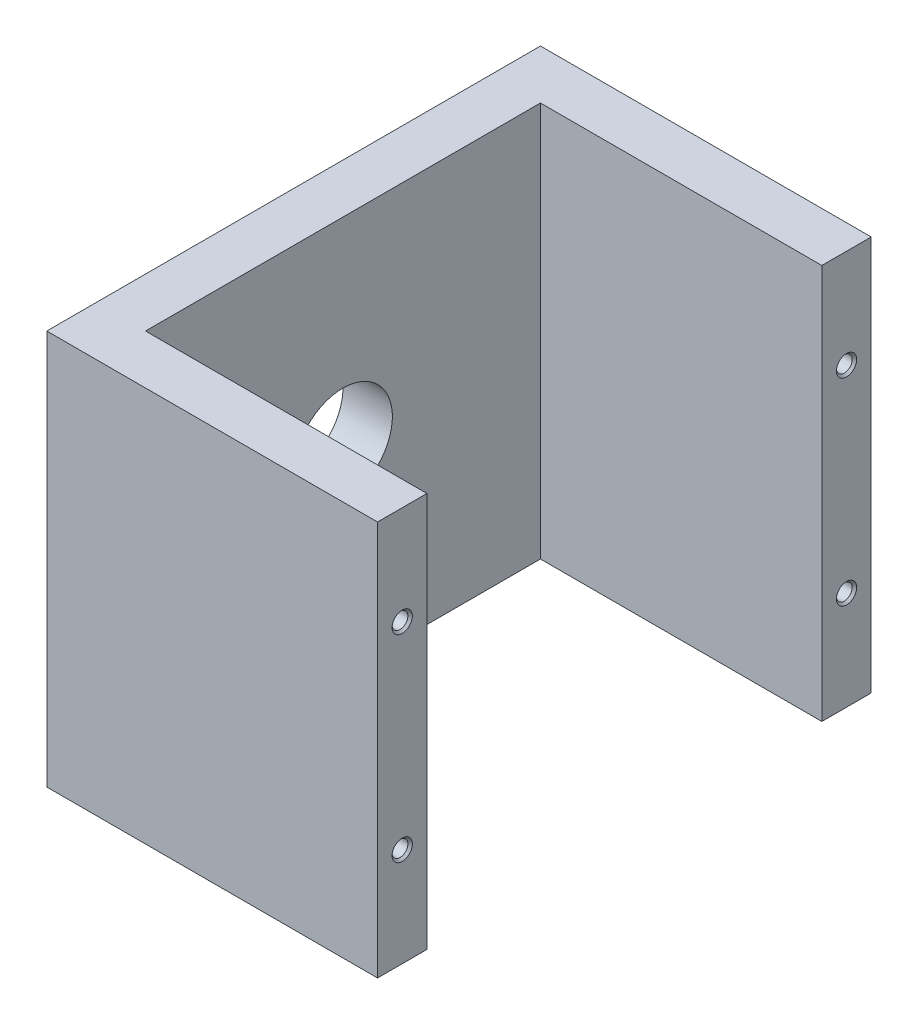
ISO-10303-21;
HEADER;
FILE_DESCRIPTION(('STEP AP214'),'2;1');
FILE_NAME('part.step','',(''),(''),'','','');
FILE_SCHEMA(('AUTOMOTIVE_DESIGN { 1 0 10303 214 1 1 1 1 }'));
ENDSEC;
DATA;
#1=APPLICATION_CONTEXT('core data for automotive mechanical design processes');
#2=APPLICATION_PROTOCOL_DEFINITION('international standard','automotive_design',2000,#1);
#3=PRODUCT_CONTEXT('',#1,'mechanical');
#4=PRODUCT('Part','Part','',(#3));
#5=PRODUCT_RELATED_PRODUCT_CATEGORY('part','',(#4));
#6=PRODUCT_DEFINITION_FORMATION('','',#4);
#7=PRODUCT_DEFINITION_CONTEXT('part definition',#1,'design');
#8=PRODUCT_DEFINITION('design','',#6,#7);
#9=PRODUCT_DEFINITION_SHAPE('','',#8);
#10=(LENGTH_UNIT() NAMED_UNIT(*) SI_UNIT(.MILLI.,.METRE.));
#11=(NAMED_UNIT(*) PLANE_ANGLE_UNIT() SI_UNIT($,.RADIAN.));
#12=(NAMED_UNIT(*) SI_UNIT($,.STERADIAN.) SOLID_ANGLE_UNIT());
#13=UNCERTAINTY_MEASURE_WITH_UNIT(LENGTH_MEASURE(1.E-05),#10,'distance_accuracy_value','');
#14=(GEOMETRIC_REPRESENTATION_CONTEXT(3) GLOBAL_UNCERTAINTY_ASSIGNED_CONTEXT((#13)) GLOBAL_UNIT_ASSIGNED_CONTEXT((#10,
#11,#12)) REPRESENTATION_CONTEXT('',''));
#15=CARTESIAN_POINT('',(0.,0.,0.));
#16=DIRECTION('',(0.,0.,1.));
#17=DIRECTION('',(1.,0.,0.));
#18=AXIS2_PLACEMENT_3D('',#15,#16,#17);
#19=CARTESIAN_POINT('',(0.,40.,50.));
#20=DIRECTION('',(1.,0.,0.));
#21=DIRECTION('',(0.,0.,-1.));
#22=AXIS2_PLACEMENT_3D('',#19,#20,#21);
#23=PLANE('',#22);
#24=CARTESIAN_POINT('',(0.,20.,25.));
#25=DIRECTION('',(-1.,0.,0.));
#26=DIRECTION('',(0.,0.,1.));
#27=AXIS2_PLACEMENT_3D('',#24,#25,#26);
#28=CIRCLE('',#27,5.);
#29=CARTESIAN_POINT('',(0.,20.,30.));
#30=VERTEX_POINT('',#29);
#31=EDGE_CURVE('E217',#30,#30,#28,.T.);
#32=ORIENTED_EDGE('',*,*,#31,.F.);
#33=EDGE_LOOP('',(#32));
#34=FACE_BOUND('',#33,.T.);
#35=DIRECTION('',(0.,0.,1.));
#36=VECTOR('',#35,1.);
#37=CARTESIAN_POINT('',(0.,0.,50.));
#38=LINE('',#37,#36);
#39=CARTESIAN_POINT('',(0.,0.,0.));
#40=VERTEX_POINT('',#39);
#41=CARTESIAN_POINT('',(0.,0.,50.));
#42=VERTEX_POINT('',#41);
#43=EDGE_CURVE('E147',#40,#42,#38,.T.);
#44=ORIENTED_EDGE('',*,*,#43,.T.);
#45=DIRECTION('',(0.,-1.,0.));
#46=VECTOR('',#45,1.);
#47=CARTESIAN_POINT('',(0.,40.,50.));
#48=LINE('',#47,#46);
#49=CARTESIAN_POINT('',(0.,40.,50.));
#50=VERTEX_POINT('',#49);
#51=EDGE_CURVE('E11',#50,#42,#48,.T.);
#52=ORIENTED_EDGE('',*,*,#51,.F.);
#53=DIRECTION('',(0.,0.,1.));
#54=VECTOR('',#53,1.);
#55=CARTESIAN_POINT('',(0.,40.,50.));
#56=LINE('',#55,#54);
#57=CARTESIAN_POINT('',(0.,40.,0.));
#58=VERTEX_POINT('',#57);
#59=EDGE_CURVE('E170',#58,#50,#56,.T.);
#60=ORIENTED_EDGE('',*,*,#59,.F.);
#61=DIRECTION('',(0.,-1.,0.));
#62=VECTOR('',#61,1.);
#63=CARTESIAN_POINT('',(0.,40.,0.));
#64=LINE('',#63,#62);
#65=EDGE_CURVE('E143',#58,#40,#64,.T.);
#66=ORIENTED_EDGE('',*,*,#65,.T.);
#67=EDGE_LOOP('',(#44,#52,#60,#66));
#68=FACE_BOUND('',#67,.T.);
#69=ADVANCED_FACE('F43',(#34,#68),#23,.F.);
#70=CARTESIAN_POINT('',(33.5,40.,50.));
#71=DIRECTION('',(0.,0.,-1.));
#72=DIRECTION('',(-1.,0.,0.));
#73=AXIS2_PLACEMENT_3D('',#70,#71,#72);
#74=PLANE('',#73);
#75=DIRECTION('',(1.,0.,0.));
#76=VECTOR('',#75,1.);
#77=CARTESIAN_POINT('',(33.5,0.,50.));
#78=LINE('',#77,#76);
#79=CARTESIAN_POINT('',(33.5,0.,50.));
#80=VERTEX_POINT('',#79);
#81=EDGE_CURVE('E151',#42,#80,#78,.T.);
#82=ORIENTED_EDGE('',*,*,#81,.T.);
#83=DIRECTION('',(0.,-1.,0.));
#84=VECTOR('',#83,1.);
#85=CARTESIAN_POINT('',(33.5,40.,50.));
#86=LINE('',#85,#84);
#87=CARTESIAN_POINT('',(33.5,40.,50.));
#88=VERTEX_POINT('',#87);
#89=EDGE_CURVE('E52',#88,#80,#86,.T.);
#90=ORIENTED_EDGE('',*,*,#89,.F.);
#91=DIRECTION('',(1.,0.,0.));
#92=VECTOR('',#91,1.);
#93=CARTESIAN_POINT('',(33.5,40.,50.));
#94=LINE('',#93,#92);
#95=EDGE_CURVE('E104',#50,#88,#94,.T.);
#96=ORIENTED_EDGE('',*,*,#95,.F.);
#97=ORIENTED_EDGE('',*,*,#51,.T.);
#98=EDGE_LOOP('',(#82,#90,#96,#97));
#99=FACE_BOUND('',#98,.T.);
#100=ADVANCED_FACE('F274',(#99),#74,.F.);
#101=CARTESIAN_POINT('',(33.5,40.,45.));
#102=DIRECTION('',(-1.,0.,0.));
#103=DIRECTION('',(0.,0.,1.));
#104=AXIS2_PLACEMENT_3D('',#101,#102,#103);
#105=PLANE('',#104);
#106=CARTESIAN_POINT('',(33.5,30.,47.5));
#107=DIRECTION('',(1.,0.,0.));
#108=DIRECTION('',(0.,0.,-1.));
#109=AXIS2_PLACEMENT_3D('',#106,#107,#108);
#110=CIRCLE('',#109,1.025);
#111=CARTESIAN_POINT('',(33.5,30.,46.475));
#112=VERTEX_POINT('',#111);
#113=EDGE_CURVE('E265',#112,#112,#110,.T.);
#114=ORIENTED_EDGE('',*,*,#113,.F.);
#115=EDGE_LOOP('',(#114));
#116=FACE_BOUND('',#115,.T.);
#117=CARTESIAN_POINT('',(33.5,10.,47.5));
#118=DIRECTION('',(1.,0.,0.));
#119=DIRECTION('',(0.,0.,-1.));
#120=AXIS2_PLACEMENT_3D('',#117,#118,#119);
#121=CIRCLE('',#120,1.025);
#122=CARTESIAN_POINT('',(33.5,10.,46.475));
#123=VERTEX_POINT('',#122);
#124=EDGE_CURVE('E253',#123,#123,#121,.T.);
#125=ORIENTED_EDGE('',*,*,#124,.F.);
#126=EDGE_LOOP('',(#125));
#127=FACE_BOUND('',#126,.T.);
#128=DIRECTION('',(0.,0.,-1.));
#129=VECTOR('',#128,1.);
#130=CARTESIAN_POINT('',(33.5,0.,45.));
#131=LINE('',#130,#129);
#132=CARTESIAN_POINT('',(33.5,0.,45.));
#133=VERTEX_POINT('',#132);
#134=EDGE_CURVE('E155',#80,#133,#131,.T.);
#135=ORIENTED_EDGE('',*,*,#134,.T.);
#136=DIRECTION('',(0.,-1.,0.));
#137=VECTOR('',#136,1.);
#138=CARTESIAN_POINT('',(33.5,40.,45.));
#139=LINE('',#138,#137);
#140=CARTESIAN_POINT('',(33.5,40.,45.));
#141=VERTEX_POINT('',#140);
#142=EDGE_CURVE('E181',#141,#133,#139,.T.);
#143=ORIENTED_EDGE('',*,*,#142,.F.);
#144=DIRECTION('',(0.,0.,-1.));
#145=VECTOR('',#144,1.);
#146=CARTESIAN_POINT('',(33.5,40.,45.));
#147=LINE('',#146,#145);
#148=EDGE_CURVE('E191',#88,#141,#147,.T.);
#149=ORIENTED_EDGE('',*,*,#148,.F.);
#150=ORIENTED_EDGE('',*,*,#89,.T.);
#151=EDGE_LOOP('',(#135,#143,#149,#150));
#152=FACE_BOUND('',#151,.T.);
#153=ADVANCED_FACE('F189',(#116,#127,#152),#105,.F.);
#154=CARTESIAN_POINT('',(5.00000000000001,40.,45.));
#155=DIRECTION('',(0.,0.,1.));
#156=DIRECTION('',(1.,0.,0.));
#157=AXIS2_PLACEMENT_3D('',#154,#155,#156);
#158=PLANE('',#157);
#159=DIRECTION('',(-1.,0.,0.));
#160=VECTOR('',#159,1.);
#161=CARTESIAN_POINT('',(5.00000000000001,0.,45.));
#162=LINE('',#161,#160);
#163=CARTESIAN_POINT('',(5.00000000000001,0.,45.));
#164=VERTEX_POINT('',#163);
#165=EDGE_CURVE('E158',#133,#164,#162,.T.);
#166=ORIENTED_EDGE('',*,*,#165,.T.);
#167=DIRECTION('',(0.,-1.,0.));
#168=VECTOR('',#167,1.);
#169=CARTESIAN_POINT('',(5.00000000000001,40.,45.));
#170=LINE('',#169,#168);
#171=CARTESIAN_POINT('',(5.00000000000001,40.,45.));
#172=VERTEX_POINT('',#171);
#173=EDGE_CURVE('E177',#172,#164,#170,.T.);
#174=ORIENTED_EDGE('',*,*,#173,.F.);
#175=DIRECTION('',(-1.,0.,0.));
#176=VECTOR('',#175,1.);
#177=CARTESIAN_POINT('',(5.00000000000001,40.,45.));
#178=LINE('',#177,#176);
#179=EDGE_CURVE('E204',#141,#172,#178,.T.);
#180=ORIENTED_EDGE('',*,*,#179,.F.);
#181=ORIENTED_EDGE('',*,*,#142,.T.);
#182=EDGE_LOOP('',(#166,#174,#180,#181));
#183=FACE_BOUND('',#182,.T.);
#184=ADVANCED_FACE('F199',(#183),#158,.F.);
#185=CARTESIAN_POINT('',(5.,40.,5.));
#186=DIRECTION('',(-1.,0.,0.));
#187=DIRECTION('',(0.,0.,1.));
#188=AXIS2_PLACEMENT_3D('',#185,#186,#187);
#189=PLANE('',#188);
#190=CARTESIAN_POINT('',(5.,20.,25.));
#191=DIRECTION('',(-1.,0.,0.));
#192=DIRECTION('',(0.,0.,1.));
#193=AXIS2_PLACEMENT_3D('',#190,#191,#192);
#194=CIRCLE('',#193,5.);
#195=CARTESIAN_POINT('',(5.00000000000001,20.,30.));
#196=VERTEX_POINT('',#195);
#197=EDGE_CURVE('E152',#196,#196,#194,.F.);
#198=ORIENTED_EDGE('',*,*,#197,.F.);
#199=EDGE_LOOP('',(#198));
#200=FACE_BOUND('',#199,.T.);
#201=DIRECTION('',(0.,0.,-1.));
#202=VECTOR('',#201,1.);
#203=CARTESIAN_POINT('',(5.,0.,5.));
#204=LINE('',#203,#202);
#205=CARTESIAN_POINT('',(5.,0.,5.));
#206=VERTEX_POINT('',#205);
#207=EDGE_CURVE('E161',#164,#206,#204,.T.);
#208=ORIENTED_EDGE('',*,*,#207,.T.);
#209=DIRECTION('',(0.,-1.,0.));
#210=VECTOR('',#209,1.);
#211=CARTESIAN_POINT('',(5.,40.,5.));
#212=LINE('',#211,#210);
#213=CARTESIAN_POINT('',(5.,40.,5.));
#214=VERTEX_POINT('',#213);
#215=EDGE_CURVE('E136',#214,#206,#212,.T.);
#216=ORIENTED_EDGE('',*,*,#215,.F.);
#217=DIRECTION('',(0.,0.,-1.));
#218=VECTOR('',#217,1.);
#219=CARTESIAN_POINT('',(5.,40.,5.));
#220=LINE('',#219,#218);
#221=EDGE_CURVE('E125',#172,#214,#220,.T.);
#222=ORIENTED_EDGE('',*,*,#221,.F.);
#223=ORIENTED_EDGE('',*,*,#173,.T.);
#224=EDGE_LOOP('',(#208,#216,#222,#223));
#225=FACE_BOUND('',#224,.T.);
#226=ADVANCED_FACE('F202',(#200,#225),#189,.F.);
#227=CARTESIAN_POINT('',(33.5,40.,5.));
#228=DIRECTION('',(0.,0.,-1.));
#229=DIRECTION('',(-1.,0.,0.));
#230=AXIS2_PLACEMENT_3D('',#227,#228,#229);
#231=PLANE('',#230);
#232=DIRECTION('',(1.,0.,0.));
#233=VECTOR('',#232,1.);
#234=CARTESIAN_POINT('',(33.5,0.,5.));
#235=LINE('',#234,#233);
#236=CARTESIAN_POINT('',(33.5,0.,5.));
#237=VERTEX_POINT('',#236);
#238=EDGE_CURVE('E134',#206,#237,#235,.T.);
#239=ORIENTED_EDGE('',*,*,#238,.T.);
#240=DIRECTION('',(0.,-1.,0.));
#241=VECTOR('',#240,1.);
#242=CARTESIAN_POINT('',(33.5,40.,5.));
#243=LINE('',#242,#241);
#244=CARTESIAN_POINT('',(33.5,40.,5.));
#245=VERTEX_POINT('',#244);
#246=EDGE_CURVE('E131',#245,#237,#243,.T.);
#247=ORIENTED_EDGE('',*,*,#246,.F.);
#248=DIRECTION('',(1.,0.,0.));
#249=VECTOR('',#248,1.);
#250=CARTESIAN_POINT('',(33.5,40.,5.));
#251=LINE('',#250,#249);
#252=EDGE_CURVE('E119',#214,#245,#251,.T.);
#253=ORIENTED_EDGE('',*,*,#252,.F.);
#254=ORIENTED_EDGE('',*,*,#215,.T.);
#255=EDGE_LOOP('',(#239,#247,#253,#254));
#256=FACE_BOUND('',#255,.T.);
#257=ADVANCED_FACE('F132',(#256),#231,.F.);
#258=CARTESIAN_POINT('',(33.5,40.,0.));
#259=DIRECTION('',(-1.,0.,0.));
#260=DIRECTION('',(0.,0.,1.));
#261=AXIS2_PLACEMENT_3D('',#258,#259,#260);
#262=PLANE('',#261);
#263=CARTESIAN_POINT('',(33.5,10.,2.49999999999998));
#264=DIRECTION('',(1.,0.,0.));
#265=DIRECTION('',(0.,0.,-1.));
#266=AXIS2_PLACEMENT_3D('',#263,#264,#265);
#267=CIRCLE('',#266,1.025);
#268=CARTESIAN_POINT('',(33.5,10.,1.47499999999998));
#269=VERTEX_POINT('',#268);
#270=EDGE_CURVE('E241',#269,#269,#267,.T.);
#271=ORIENTED_EDGE('',*,*,#270,.F.);
#272=EDGE_LOOP('',(#271));
#273=FACE_BOUND('',#272,.T.);
#274=CARTESIAN_POINT('',(33.5,30.,2.49999999999998));
#275=DIRECTION('',(1.,0.,0.));
#276=DIRECTION('',(0.,0.,-1.));
#277=AXIS2_PLACEMENT_3D('',#274,#275,#276);
#278=CIRCLE('',#277,1.025);
#279=CARTESIAN_POINT('',(33.5,30.,1.47499999999999));
#280=VERTEX_POINT('',#279);
#281=EDGE_CURVE('E229',#280,#280,#278,.T.);
#282=ORIENTED_EDGE('',*,*,#281,.F.);
#283=EDGE_LOOP('',(#282));
#284=FACE_BOUND('',#283,.T.);
#285=DIRECTION('',(0.,0.,-1.));
#286=VECTOR('',#285,1.);
#287=CARTESIAN_POINT('',(33.5,0.,0.));
#288=LINE('',#287,#286);
#289=CARTESIAN_POINT('',(33.5,0.,0.));
#290=VERTEX_POINT('',#289);
#291=EDGE_CURVE('E90',#237,#290,#288,.T.);
#292=ORIENTED_EDGE('',*,*,#291,.T.);
#293=DIRECTION('',(0.,-1.,0.));
#294=VECTOR('',#293,1.);
#295=CARTESIAN_POINT('',(33.5,40.,0.));
#296=LINE('',#295,#294);
#297=CARTESIAN_POINT('',(33.5,40.,0.));
#298=VERTEX_POINT('',#297);
#299=EDGE_CURVE('E137',#298,#290,#296,.T.);
#300=ORIENTED_EDGE('',*,*,#299,.F.);
#301=DIRECTION('',(0.,0.,-1.));
#302=VECTOR('',#301,1.);
#303=CARTESIAN_POINT('',(33.5,40.,0.));
#304=LINE('',#303,#302);
#305=EDGE_CURVE('E123',#245,#298,#304,.T.);
#306=ORIENTED_EDGE('',*,*,#305,.F.);
#307=ORIENTED_EDGE('',*,*,#246,.T.);
#308=EDGE_LOOP('',(#292,#300,#306,#307));
#309=FACE_BOUND('',#308,.T.);
#310=ADVANCED_FACE('F139',(#273,#284,#309),#262,.F.);
#311=CARTESIAN_POINT('',(33.5,40.,0.));
#312=DIRECTION('',(0.,0.,1.));
#313=DIRECTION('',(1.,0.,0.));
#314=AXIS2_PLACEMENT_3D('',#311,#312,#313);
#315=PLANE('',#314);
#316=DIRECTION('',(-1.,0.,0.));
#317=VECTOR('',#316,1.);
#318=CARTESIAN_POINT('',(33.5,0.,0.));
#319=LINE('',#318,#317);
#320=EDGE_CURVE('E96',#290,#40,#319,.T.);
#321=ORIENTED_EDGE('',*,*,#320,.T.);
#322=ORIENTED_EDGE('',*,*,#65,.F.);
#323=DIRECTION('',(-1.,0.,0.));
#324=VECTOR('',#323,1.);
#325=CARTESIAN_POINT('',(33.5,40.,0.));
#326=LINE('',#325,#324);
#327=EDGE_CURVE('E60',#298,#58,#326,.T.);
#328=ORIENTED_EDGE('',*,*,#327,.F.);
#329=ORIENTED_EDGE('',*,*,#299,.T.);
#330=EDGE_LOOP('',(#321,#322,#328,#329));
#331=FACE_BOUND('',#330,.T.);
#332=ADVANCED_FACE('F304',(#331),#315,.F.);
#333=CARTESIAN_POINT('',(0.,40.,0.));
#334=DIRECTION('',(0.,1.,0.));
#335=DIRECTION('',(0.,0.,1.));
#336=AXIS2_PLACEMENT_3D('',#333,#334,#335);
#337=PLANE('',#336);
#338=ORIENTED_EDGE('',*,*,#59,.T.);
#339=ORIENTED_EDGE('',*,*,#95,.T.);
#340=ORIENTED_EDGE('',*,*,#148,.T.);
#341=ORIENTED_EDGE('',*,*,#179,.T.);
#342=ORIENTED_EDGE('',*,*,#221,.T.);
#343=ORIENTED_EDGE('',*,*,#252,.T.);
#344=ORIENTED_EDGE('',*,*,#305,.T.);
#345=ORIENTED_EDGE('',*,*,#327,.T.);
#346=EDGE_LOOP('',(#338,#339,#340,#341,#342,#343,#344,#345));
#347=FACE_BOUND('',#346,.T.);
#348=ADVANCED_FACE('F121',(#347),#337,.T.);
#349=CARTESIAN_POINT('',(0.,0.,0.));
#350=DIRECTION('',(0.,1.,0.));
#351=DIRECTION('',(0.,0.,1.));
#352=AXIS2_PLACEMENT_3D('',#349,#350,#351);
#353=PLANE('',#352);
#354=ORIENTED_EDGE('',*,*,#43,.F.);
#355=ORIENTED_EDGE('',*,*,#320,.F.);
#356=ORIENTED_EDGE('',*,*,#291,.F.);
#357=ORIENTED_EDGE('',*,*,#238,.F.);
#358=ORIENTED_EDGE('',*,*,#207,.F.);
#359=ORIENTED_EDGE('',*,*,#165,.F.);
#360=ORIENTED_EDGE('',*,*,#134,.F.);
#361=ORIENTED_EDGE('',*,*,#81,.F.);
#362=EDGE_LOOP('',(#354,#355,#356,#357,#358,#359,#360,#361));
#363=FACE_BOUND('',#362,.T.);
#364=ADVANCED_FACE('F195',(#363),#353,.F.);
#365=CARTESIAN_POINT('',(33.501,20.,25.));
#366=DIRECTION('',(-1.,0.,0.));
#367=DIRECTION('',(0.,0.,1.));
#368=AXIS2_PLACEMENT_3D('',#365,#366,#367);
#369=CYLINDRICAL_SURFACE('',#368,5.);
#370=ORIENTED_EDGE('',*,*,#31,.T.);
#371=EDGE_LOOP('',(#370));
#372=FACE_BOUND('',#371,.T.);
#373=ORIENTED_EDGE('',*,*,#197,.T.);
#374=EDGE_LOOP('',(#373));
#375=FACE_BOUND('',#374,.T.);
#376=ADVANCED_FACE('F354',(#372,#375),#369,.F.);
#377=CARTESIAN_POINT('',(28.5,30.,2.49999999999998));
#378=DIRECTION('',(1.,0.,0.));
#379=DIRECTION('',(0.,0.,-1.));
#380=AXIS2_PLACEMENT_3D('',#377,#378,#379);
#381=CONICAL_SURFACE('',#380,0.799999999999999,1.02974425867665);
#382=CARTESIAN_POINT('',(28.019311504778,30.,2.49999999999998));
#383=VERTEX_POINT('',#382);
#384=VERTEX_LOOP('',#383);
#385=FACE_BOUND('',#384,.T.);
#386=CARTESIAN_POINT('',(28.5,30.,2.49999999999998));
#387=DIRECTION('',(1.,0.,0.));
#388=DIRECTION('',(0.,0.,-1.));
#389=AXIS2_PLACEMENT_3D('',#386,#387,#388);
#390=CIRCLE('',#389,0.799999999999999);
#391=CARTESIAN_POINT('',(28.5,30.,1.69999999999999));
#392=VERTEX_POINT('',#391);
#393=EDGE_CURVE('E221',#392,#392,#390,.T.);
#394=ORIENTED_EDGE('',*,*,#393,.T.);
#395=EDGE_LOOP('',(#394));
#396=FACE_BOUND('',#395,.T.);
#397=ADVANCED_FACE('F348',(#385,#396),#381,.F.);
#398=CARTESIAN_POINT('',(33.5,30.,2.49999999999998));
#399=DIRECTION('',(1.,0.,0.));
#400=DIRECTION('',(0.,0.,-1.));
#401=AXIS2_PLACEMENT_3D('',#398,#399,#400);
#402=CYLINDRICAL_SURFACE('',#401,0.799999999999999);
#403=ORIENTED_EDGE('',*,*,#393,.F.);
#404=EDGE_LOOP('',(#403));
#405=FACE_BOUND('',#404,.T.);
#406=CARTESIAN_POINT('',(33.275,30.,2.49999999999998));
#407=DIRECTION('',(1.,0.,0.));
#408=DIRECTION('',(0.,0.,-1.));
#409=AXIS2_PLACEMENT_3D('',#406,#407,#408);
#410=CIRCLE('',#409,0.799999999999999);
#411=CARTESIAN_POINT('',(33.275,30.,1.69999999999999));
#412=VERTEX_POINT('',#411);
#413=EDGE_CURVE('E225',#412,#412,#410,.T.);
#414=ORIENTED_EDGE('',*,*,#413,.T.);
#415=EDGE_LOOP('',(#414));
#416=FACE_BOUND('',#415,.T.);
#417=ADVANCED_FACE('F353',(#405,#416),#402,.F.);
#418=CARTESIAN_POINT('',(33.5,30.,2.49999999999998));
#419=DIRECTION('',(1.,0.,0.));
#420=DIRECTION('',(0.,0.,-1.));
#421=AXIS2_PLACEMENT_3D('',#418,#419,#420);
#422=CONICAL_SURFACE('',#421,1.025,0.785398163397456);
#423=ORIENTED_EDGE('',*,*,#413,.F.);
#424=EDGE_LOOP('',(#423));
#425=FACE_BOUND('',#424,.T.);
#426=ORIENTED_EDGE('',*,*,#281,.T.);
#427=EDGE_LOOP('',(#426));
#428=FACE_BOUND('',#427,.T.);
#429=ADVANCED_FACE('F367',(#425,#428),#422,.F.);
#430=CARTESIAN_POINT('',(28.5,10.,2.49999999999998));
#431=DIRECTION('',(1.,0.,0.));
#432=DIRECTION('',(0.,0.,-1.));
#433=AXIS2_PLACEMENT_3D('',#430,#431,#432);
#434=CONICAL_SURFACE('',#433,0.799999999999999,1.02974425867665);
#435=CARTESIAN_POINT('',(28.019311504778,10.,2.49999999999998));
#436=VERTEX_POINT('',#435);
#437=VERTEX_LOOP('',#436);
#438=FACE_BOUND('',#437,.T.);
#439=CARTESIAN_POINT('',(28.5,10.,2.49999999999998));
#440=DIRECTION('',(1.,0.,0.));
#441=DIRECTION('',(0.,0.,-1.));
#442=AXIS2_PLACEMENT_3D('',#439,#440,#441);
#443=CIRCLE('',#442,0.799999999999999);
#444=CARTESIAN_POINT('',(28.5,10.,1.69999999999999));
#445=VERTEX_POINT('',#444);
#446=EDGE_CURVE('E233',#445,#445,#443,.T.);
#447=ORIENTED_EDGE('',*,*,#446,.T.);
#448=EDGE_LOOP('',(#447));
#449=FACE_BOUND('',#448,.T.);
#450=ADVANCED_FACE('F380',(#438,#449),#434,.F.);
#451=CARTESIAN_POINT('',(33.5,10.,2.49999999999998));
#452=DIRECTION('',(1.,0.,0.));
#453=DIRECTION('',(0.,0.,-1.));
#454=AXIS2_PLACEMENT_3D('',#451,#452,#453);
#455=CYLINDRICAL_SURFACE('',#454,0.799999999999999);
#456=ORIENTED_EDGE('',*,*,#446,.F.);
#457=EDGE_LOOP('',(#456));
#458=FACE_BOUND('',#457,.T.);
#459=CARTESIAN_POINT('',(33.275,10.,2.49999999999998));
#460=DIRECTION('',(1.,0.,0.));
#461=DIRECTION('',(0.,0.,-1.));
#462=AXIS2_PLACEMENT_3D('',#459,#460,#461);
#463=CIRCLE('',#462,0.799999999999999);
#464=CARTESIAN_POINT('',(33.275,10.,1.69999999999999));
#465=VERTEX_POINT('',#464);
#466=EDGE_CURVE('E237',#465,#465,#463,.T.);
#467=ORIENTED_EDGE('',*,*,#466,.T.);
#468=EDGE_LOOP('',(#467));
#469=FACE_BOUND('',#468,.T.);
#470=ADVANCED_FACE('F391',(#458,#469),#455,.F.);
#471=CARTESIAN_POINT('',(33.5,10.,2.49999999999998));
#472=DIRECTION('',(1.,0.,0.));
#473=DIRECTION('',(0.,0.,-1.));
#474=AXIS2_PLACEMENT_3D('',#471,#472,#473);
#475=CONICAL_SURFACE('',#474,1.025,0.78539816339746);
#476=ORIENTED_EDGE('',*,*,#466,.F.);
#477=EDGE_LOOP('',(#476));
#478=FACE_BOUND('',#477,.T.);
#479=ORIENTED_EDGE('',*,*,#270,.T.);
#480=EDGE_LOOP('',(#479));
#481=FACE_BOUND('',#480,.T.);
#482=ADVANCED_FACE('F401',(#478,#481),#475,.F.);
#483=CARTESIAN_POINT('',(28.5,10.,47.5));
#484=DIRECTION('',(1.,0.,0.));
#485=DIRECTION('',(0.,0.,-1.));
#486=AXIS2_PLACEMENT_3D('',#483,#484,#485);
#487=CONICAL_SURFACE('',#486,0.799999999999999,1.02974425867665);
#488=CARTESIAN_POINT('',(28.0193115047779,10.,47.5));
#489=VERTEX_POINT('',#488);
#490=VERTEX_LOOP('',#489);
#491=FACE_BOUND('',#490,.T.);
#492=CARTESIAN_POINT('',(28.5,10.,47.5));
#493=DIRECTION('',(1.,0.,0.));
#494=DIRECTION('',(0.,0.,-1.));
#495=AXIS2_PLACEMENT_3D('',#492,#493,#494);
#496=CIRCLE('',#495,0.799999999999999);
#497=CARTESIAN_POINT('',(28.5,10.,46.7));
#498=VERTEX_POINT('',#497);
#499=EDGE_CURVE('E245',#498,#498,#496,.T.);
#500=ORIENTED_EDGE('',*,*,#499,.T.);
#501=EDGE_LOOP('',(#500));
#502=FACE_BOUND('',#501,.T.);
#503=ADVANCED_FACE('F291',(#491,#502),#487,.F.);
#504=CARTESIAN_POINT('',(33.5,10.,47.5));
#505=DIRECTION('',(1.,0.,0.));
#506=DIRECTION('',(0.,0.,-1.));
#507=AXIS2_PLACEMENT_3D('',#504,#505,#506);
#508=CYLINDRICAL_SURFACE('',#507,0.799999999999999);
#509=ORIENTED_EDGE('',*,*,#499,.F.);
#510=EDGE_LOOP('',(#509));
#511=FACE_BOUND('',#510,.T.);
#512=CARTESIAN_POINT('',(33.275,10.,47.5));
#513=DIRECTION('',(1.,0.,0.));
#514=DIRECTION('',(0.,0.,-1.));
#515=AXIS2_PLACEMENT_3D('',#512,#513,#514);
#516=CIRCLE('',#515,0.799999999999999);
#517=CARTESIAN_POINT('',(33.275,10.,46.7));
#518=VERTEX_POINT('',#517);
#519=EDGE_CURVE('E249',#518,#518,#516,.T.);
#520=ORIENTED_EDGE('',*,*,#519,.T.);
#521=EDGE_LOOP('',(#520));
#522=FACE_BOUND('',#521,.T.);
#523=ADVANCED_FACE('F281',(#511,#522),#508,.F.);
#524=CARTESIAN_POINT('',(33.5,10.,47.5));
#525=DIRECTION('',(1.,0.,0.));
#526=DIRECTION('',(0.,0.,-1.));
#527=AXIS2_PLACEMENT_3D('',#524,#525,#526);
#528=CONICAL_SURFACE('',#527,1.025,0.785398163397445);
#529=ORIENTED_EDGE('',*,*,#519,.F.);
#530=EDGE_LOOP('',(#529));
#531=FACE_BOUND('',#530,.T.);
#532=ORIENTED_EDGE('',*,*,#124,.T.);
#533=EDGE_LOOP('',(#532));
#534=FACE_BOUND('',#533,.T.);
#535=ADVANCED_FACE('F278',(#531,#534),#528,.F.);
#536=CARTESIAN_POINT('',(28.5,30.,47.5));
#537=DIRECTION('',(1.,0.,0.));
#538=DIRECTION('',(0.,0.,-1.));
#539=AXIS2_PLACEMENT_3D('',#536,#537,#538);
#540=CONICAL_SURFACE('',#539,0.799999999999999,1.02974425867665);
#541=CARTESIAN_POINT('',(28.0193115047779,30.,47.5));
#542=VERTEX_POINT('',#541);
#543=VERTEX_LOOP('',#542);
#544=FACE_BOUND('',#543,.T.);
#545=CARTESIAN_POINT('',(28.5,30.,47.5));
#546=DIRECTION('',(1.,0.,0.));
#547=DIRECTION('',(0.,0.,-1.));
#548=AXIS2_PLACEMENT_3D('',#545,#546,#547);
#549=CIRCLE('',#548,0.799999999999999);
#550=CARTESIAN_POINT('',(28.5,30.,46.7));
#551=VERTEX_POINT('',#550);
#552=EDGE_CURVE('E257',#551,#551,#549,.T.);
#553=ORIENTED_EDGE('',*,*,#552,.T.);
#554=EDGE_LOOP('',(#553));
#555=FACE_BOUND('',#554,.T.);
#556=ADVANCED_FACE('F280',(#544,#555),#540,.F.);
#557=CARTESIAN_POINT('',(33.5,30.,47.5));
#558=DIRECTION('',(1.,0.,0.));
#559=DIRECTION('',(0.,0.,-1.));
#560=AXIS2_PLACEMENT_3D('',#557,#558,#559);
#561=CYLINDRICAL_SURFACE('',#560,0.799999999999999);
#562=ORIENTED_EDGE('',*,*,#552,.F.);
#563=EDGE_LOOP('',(#562));
#564=FACE_BOUND('',#563,.T.);
#565=CARTESIAN_POINT('',(33.275,30.,47.5));
#566=DIRECTION('',(1.,0.,0.));
#567=DIRECTION('',(0.,0.,-1.));
#568=AXIS2_PLACEMENT_3D('',#565,#566,#567);
#569=CIRCLE('',#568,0.799999999999999);
#570=CARTESIAN_POINT('',(33.275,30.,46.7));
#571=VERTEX_POINT('',#570);
#572=EDGE_CURVE('E261',#571,#571,#569,.T.);
#573=ORIENTED_EDGE('',*,*,#572,.T.);
#574=EDGE_LOOP('',(#573));
#575=FACE_BOUND('',#574,.T.);
#576=ADVANCED_FACE('F288',(#564,#575),#561,.F.);
#577=CARTESIAN_POINT('',(33.5,30.,47.5));
#578=DIRECTION('',(1.,0.,0.));
#579=DIRECTION('',(0.,0.,-1.));
#580=AXIS2_PLACEMENT_3D('',#577,#578,#579);
#581=CONICAL_SURFACE('',#580,1.025,0.785398163397441);
#582=ORIENTED_EDGE('',*,*,#572,.F.);
#583=EDGE_LOOP('',(#582));
#584=FACE_BOUND('',#583,.T.);
#585=ORIENTED_EDGE('',*,*,#113,.T.);
#586=EDGE_LOOP('',(#585));
#587=FACE_BOUND('',#586,.T.);
#588=ADVANCED_FACE('F270',(#584,#587),#581,.F.);
#589=CLOSED_SHELL('',(#69,#100,#153,#184,#226,#257,#310,#332,#348,#364,#376,#397,#417,#429,#450,
#470,#482,#503,#523,#535,#556,#576,#588));
#590=MANIFOLD_SOLID_BREP('B2',#589);
#591=ADVANCED_BREP_SHAPE_REPRESENTATION('',(#18,#590),#14);
#592=SHAPE_DEFINITION_REPRESENTATION(#9,#591);
ENDSEC;
END-ISO-10303-21;
